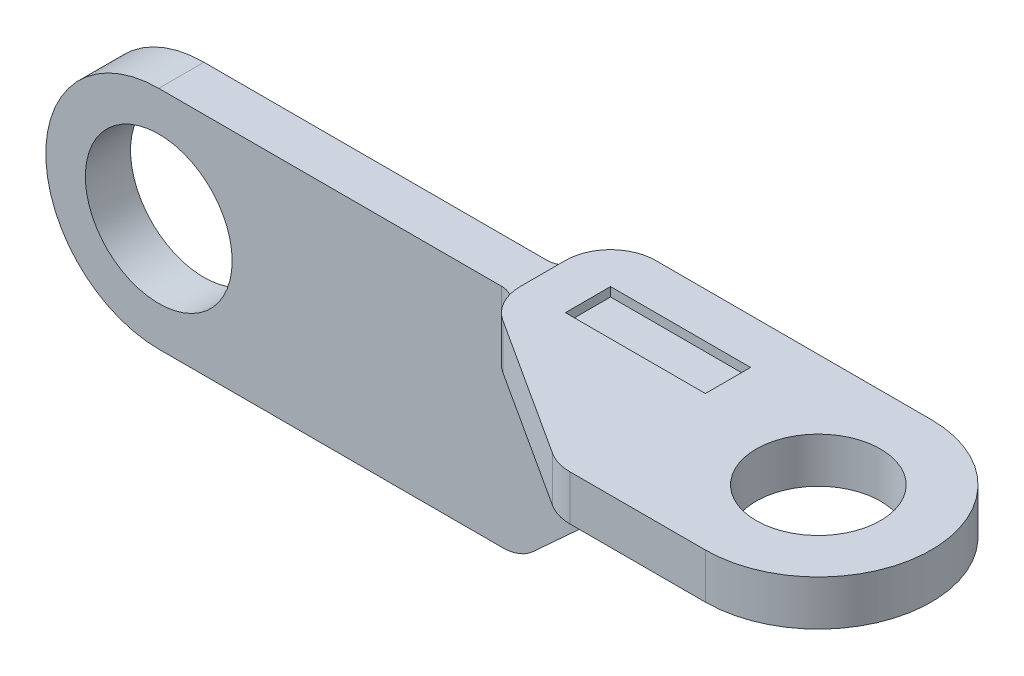
ISO-10303-21;
HEADER;
FILE_DESCRIPTION(('STEP AP214'),'2;1');
FILE_NAME('part.step','',(''),(''),'','','');
FILE_SCHEMA(('AUTOMOTIVE_DESIGN { 1 0 10303 214 1 1 1 1 }'));
ENDSEC;
DATA;
#1=APPLICATION_CONTEXT('core data for automotive mechanical design processes');
#2=APPLICATION_PROTOCOL_DEFINITION('international standard','automotive_design',2000,#1);
#3=PRODUCT_CONTEXT('',#1,'mechanical');
#4=PRODUCT('Part','Part','',(#3));
#5=PRODUCT_RELATED_PRODUCT_CATEGORY('part','',(#4));
#6=PRODUCT_DEFINITION_FORMATION('','',#4);
#7=PRODUCT_DEFINITION_CONTEXT('part definition',#1,'design');
#8=PRODUCT_DEFINITION('design','',#6,#7);
#9=PRODUCT_DEFINITION_SHAPE('','',#8);
#10=(LENGTH_UNIT() NAMED_UNIT(*) SI_UNIT(.MILLI.,.METRE.));
#11=(NAMED_UNIT(*) PLANE_ANGLE_UNIT() SI_UNIT($,.RADIAN.));
#12=(NAMED_UNIT(*) SI_UNIT($,.STERADIAN.) SOLID_ANGLE_UNIT());
#13=UNCERTAINTY_MEASURE_WITH_UNIT(LENGTH_MEASURE(1.E-05),#10,'distance_accuracy_value','');
#14=(GEOMETRIC_REPRESENTATION_CONTEXT(3) GLOBAL_UNCERTAINTY_ASSIGNED_CONTEXT((#13)) GLOBAL_UNIT_ASSIGNED_CONTEXT((#10,
#11,#12)) REPRESENTATION_CONTEXT('',''));
#15=CARTESIAN_POINT('',(0.,0.,0.));
#16=DIRECTION('',(0.,0.,1.));
#17=DIRECTION('',(1.,0.,0.));
#18=AXIS2_PLACEMENT_3D('',#15,#16,#17);
#19=CARTESIAN_POINT('',(-30.2,-3.4,-3.));
#20=DIRECTION('',(0.,0.,1.));
#21=DIRECTION('',(1.,0.,0.));
#22=AXIS2_PLACEMENT_3D('',#19,#20,#21);
#23=PLANE('',#22);
#24=CARTESIAN_POINT('',(-30.2,-3.4,-3.));
#25=DIRECTION('',(0.,0.,1.));
#26=DIRECTION('',(1.,0.,0.));
#27=AXIS2_PLACEMENT_3D('',#24,#25,#26);
#28=CIRCLE('',#27,3.25);
#29=CARTESIAN_POINT('',(-26.95,-3.4,-3.));
#30=VERTEX_POINT('',#29);
#31=EDGE_CURVE('E347',#30,#30,#28,.T.);
#32=ORIENTED_EDGE('',*,*,#31,.T.);
#33=EDGE_LOOP('',(#32));
#34=FACE_BOUND('',#33,.T.);
#35=DIRECTION('',(-1.,0.,0.));
#36=VECTOR('',#35,1.);
#37=CARTESIAN_POINT('',(-15.2,1.6,-3.));
#38=LINE('',#37,#36);
#39=CARTESIAN_POINT('',(-15.0284271247462,1.6,-3.));
#40=VERTEX_POINT('',#39);
#41=CARTESIAN_POINT('',(-30.2,1.6,-3.));
#42=VERTEX_POINT('',#41);
#43=EDGE_CURVE('E355',#40,#42,#38,.T.);
#44=ORIENTED_EDGE('',*,*,#43,.F.);
#45=DIRECTION('',(0.,-1.,0.));
#46=VECTOR('',#45,1.);
#47=CARTESIAN_POINT('',(-15.0284271247462,-3.4,-3.));
#48=LINE('',#47,#46);
#49=CARTESIAN_POINT('',(-15.0284271247462,-1.,-3.));
#50=VERTEX_POINT('',#49);
#51=EDGE_CURVE('E375',#40,#50,#48,.T.);
#52=ORIENTED_EDGE('',*,*,#51,.T.);
#53=DIRECTION('',(-1.,0.,0.));
#54=VECTOR('',#53,1.);
#55=CARTESIAN_POINT('',(-6.,-1.,-3.));
#56=LINE('',#55,#54);
#57=CARTESIAN_POINT('',(-6.26794919243112,-1.,-3.));
#58=VERTEX_POINT('',#57);
#59=EDGE_CURVE('E371',#50,#58,#56,.F.);
#60=ORIENTED_EDGE('',*,*,#59,.T.);
#61=CARTESIAN_POINT('',(-8.,0.,-3.));
#62=DIRECTION('',(0.,0.,1.));
#63=DIRECTION('',(-1.,0.,0.));
#64=AXIS2_PLACEMENT_3D('',#61,#62,#63);
#65=CIRCLE('',#64,2.);
#66=CARTESIAN_POINT('',(-6.64817639570531,-1.47396504126513,-3.));
#67=VERTEX_POINT('',#66);
#68=EDGE_CURVE('E319',#67,#58,#65,.T.);
#69=ORIENTED_EDGE('',*,*,#68,.F.);
#70=DIRECTION('',(0.736982520632564,0.675911802147345,0.));
#71=VECTOR('',#70,1.);
#72=CARTESIAN_POINT('',(-6.64817639570531,-1.47396504126513,-3.));
#73=LINE('',#72,#71);
#74=CARTESIAN_POINT('',(-13.6264361583898,-7.87396504126512,-3.));
#75=VERTEX_POINT('',#74);
#76=EDGE_CURVE('E326',#75,#67,#73,.T.);
#77=ORIENTED_EDGE('',*,*,#76,.F.);
#78=CARTESIAN_POINT('',(-14.9782597626845,-6.4,-3.));
#79=DIRECTION('',(0.,0.,1.));
#80=DIRECTION('',(-1.,0.,0.));
#81=AXIS2_PLACEMENT_3D('',#78,#79,#80);
#82=CIRCLE('',#81,2.);
#83=CARTESIAN_POINT('',(-14.9782597626845,-8.4,-3.));
#84=VERTEX_POINT('',#83);
#85=EDGE_CURVE('E322',#84,#75,#82,.T.);
#86=ORIENTED_EDGE('',*,*,#85,.F.);
#87=DIRECTION('',(1.,0.,0.));
#88=VECTOR('',#87,1.);
#89=CARTESIAN_POINT('',(-30.2,-8.4,-3.));
#90=LINE('',#89,#88);
#91=CARTESIAN_POINT('',(-30.2,-8.4,-3.));
#92=VERTEX_POINT('',#91);
#93=EDGE_CURVE('E353',#92,#84,#90,.T.);
#94=ORIENTED_EDGE('',*,*,#93,.F.);
#95=CARTESIAN_POINT('',(-30.2,-3.4,-3.));
#96=DIRECTION('',(0.,0.,1.));
#97=DIRECTION('',(1.,0.,0.));
#98=AXIS2_PLACEMENT_3D('',#95,#96,#97);
#99=CIRCLE('',#98,5.);
#100=EDGE_CURVE('E359',#42,#92,#99,.T.);
#101=ORIENTED_EDGE('',*,*,#100,.F.);
#102=EDGE_LOOP('',(#44,#52,#60,#69,#77,#86,#94,#101));
#103=FACE_BOUND('',#102,.T.);
#104=ADVANCED_FACE('F39',(#34,#103),#23,.F.);
#105=CARTESIAN_POINT('',(-30.2,-3.4,-1.));
#106=DIRECTION('',(0.,0.,1.));
#107=DIRECTION('',(1.,0.,0.));
#108=AXIS2_PLACEMENT_3D('',#105,#106,#107);
#109=PLANE('',#108);
#110=CARTESIAN_POINT('',(-30.2,-3.4,-1.));
#111=DIRECTION('',(0.,0.,1.));
#112=DIRECTION('',(1.,0.,0.));
#113=AXIS2_PLACEMENT_3D('',#110,#111,#112);
#114=CIRCLE('',#113,3.25);
#115=CARTESIAN_POINT('',(-26.95,-3.4,-1.));
#116=VERTEX_POINT('',#115);
#117=EDGE_CURVE('E340',#116,#116,#114,.T.);
#118=ORIENTED_EDGE('',*,*,#117,.F.);
#119=EDGE_LOOP('',(#118));
#120=FACE_BOUND('',#119,.T.);
#121=DIRECTION('',(-1.,0.,0.));
#122=VECTOR('',#121,1.);
#123=CARTESIAN_POINT('',(-30.2,-1.,-1.));
#124=LINE('',#123,#122);
#125=CARTESIAN_POINT('',(-6.26794919243112,-1.,-1.));
#126=VERTEX_POINT('',#125);
#127=CARTESIAN_POINT('',(-15.0284271247462,-1.,-1.));
#128=VERTEX_POINT('',#127);
#129=EDGE_CURVE('E386',#126,#128,#124,.T.);
#130=ORIENTED_EDGE('',*,*,#129,.T.);
#131=DIRECTION('',(0.,1.,0.));
#132=VECTOR('',#131,1.);
#133=CARTESIAN_POINT('',(-15.0284271247462,1.6,-1.));
#134=LINE('',#133,#132);
#135=CARTESIAN_POINT('',(-15.0284271247462,1.6,-1.));
#136=VERTEX_POINT('',#135);
#137=EDGE_CURVE('E388',#128,#136,#134,.T.);
#138=ORIENTED_EDGE('',*,*,#137,.T.);
#139=DIRECTION('',(-1.,0.,0.));
#140=VECTOR('',#139,1.);
#141=CARTESIAN_POINT('',(-15.2,1.6,-1.));
#142=LINE('',#141,#140);
#143=CARTESIAN_POINT('',(-30.2,1.6,-1.));
#144=VERTEX_POINT('',#143);
#145=EDGE_CURVE('E364',#136,#144,#142,.T.);
#146=ORIENTED_EDGE('',*,*,#145,.T.);
#147=CARTESIAN_POINT('',(-30.2,-3.4,-1.));
#148=DIRECTION('',(0.,0.,1.));
#149=DIRECTION('',(1.,0.,0.));
#150=AXIS2_PLACEMENT_3D('',#147,#148,#149);
#151=CIRCLE('',#150,5.);
#152=CARTESIAN_POINT('',(-30.2,-8.4,-1.));
#153=VERTEX_POINT('',#152);
#154=EDGE_CURVE('E356',#144,#153,#151,.T.);
#155=ORIENTED_EDGE('',*,*,#154,.T.);
#156=DIRECTION('',(1.,0.,0.));
#157=VECTOR('',#156,1.);
#158=CARTESIAN_POINT('',(-30.2,-8.4,-1.));
#159=LINE('',#158,#157);
#160=CARTESIAN_POINT('',(-14.9782597626845,-8.4,-1.));
#161=VERTEX_POINT('',#160);
#162=EDGE_CURVE('E350',#153,#161,#159,.T.);
#163=ORIENTED_EDGE('',*,*,#162,.T.);
#164=CARTESIAN_POINT('',(-14.9782597626845,-6.4,-1.));
#165=DIRECTION('',(0.,0.,1.));
#166=DIRECTION('',(-1.,0.,0.));
#167=AXIS2_PLACEMENT_3D('',#164,#165,#166);
#168=CIRCLE('',#167,2.);
#169=CARTESIAN_POINT('',(-13.6264361583898,-7.87396504126512,-1.));
#170=VERTEX_POINT('',#169);
#171=EDGE_CURVE('E332',#161,#170,#168,.T.);
#172=ORIENTED_EDGE('',*,*,#171,.T.);
#173=DIRECTION('',(0.736982520632564,0.675911802147345,0.));
#174=VECTOR('',#173,1.);
#175=CARTESIAN_POINT('',(-6.64817639570531,-1.47396504126513,-1.));
#176=LINE('',#175,#174);
#177=CARTESIAN_POINT('',(-6.64817639570531,-1.47396504126513,-1.));
#178=VERTEX_POINT('',#177);
#179=EDGE_CURVE('E323',#170,#178,#176,.T.);
#180=ORIENTED_EDGE('',*,*,#179,.T.);
#181=CARTESIAN_POINT('',(-8.,0.,-1.));
#182=DIRECTION('',(0.,0.,1.));
#183=DIRECTION('',(-1.,0.,0.));
#184=AXIS2_PLACEMENT_3D('',#181,#182,#183);
#185=CIRCLE('',#184,2.);
#186=EDGE_CURVE('E318',#178,#126,#185,.T.);
#187=ORIENTED_EDGE('',*,*,#186,.T.);
#188=EDGE_LOOP('',(#130,#138,#146,#155,#163,#172,#180,#187));
#189=FACE_BOUND('',#188,.T.);
#190=ADVANCED_FACE('F459',(#120,#189),#109,.T.);
#191=CARTESIAN_POINT('',(-30.2,-8.4,-3.));
#192=DIRECTION('',(0.,-1.,0.));
#193=DIRECTION('',(0.,0.,-1.));
#194=AXIS2_PLACEMENT_3D('',#191,#192,#193);
#195=PLANE('',#194);
#196=ORIENTED_EDGE('',*,*,#162,.F.);
#197=DIRECTION('',(0.,0.,1.));
#198=VECTOR('',#197,1.);
#199=CARTESIAN_POINT('',(-30.2,-8.4,-3.));
#200=LINE('',#199,#198);
#201=EDGE_CURVE('E369',#92,#153,#200,.T.);
#202=ORIENTED_EDGE('',*,*,#201,.F.);
#203=ORIENTED_EDGE('',*,*,#93,.T.);
#204=DIRECTION('',(0.,0.,1.));
#205=VECTOR('',#204,1.);
#206=CARTESIAN_POINT('',(-14.9782597626845,-8.4,-3.));
#207=LINE('',#206,#205);
#208=EDGE_CURVE('E343',#84,#161,#207,.T.);
#209=ORIENTED_EDGE('',*,*,#208,.T.);
#210=EDGE_LOOP('',(#196,#202,#203,#209));
#211=FACE_BOUND('',#210,.T.);
#212=ADVANCED_FACE('F465',(#211),#195,.T.);
#213=CARTESIAN_POINT('',(-30.2,-3.4,-3.));
#214=DIRECTION('',(0.,0.,1.));
#215=DIRECTION('',(1.,0.,0.));
#216=AXIS2_PLACEMENT_3D('',#213,#214,#215);
#217=CYLINDRICAL_SURFACE('',#216,5.);
#218=ORIENTED_EDGE('',*,*,#154,.F.);
#219=DIRECTION('',(0.,0.,1.));
#220=VECTOR('',#219,1.);
#221=CARTESIAN_POINT('',(-30.2,1.6,-3.));
#222=LINE('',#221,#220);
#223=EDGE_CURVE('E362',#42,#144,#222,.T.);
#224=ORIENTED_EDGE('',*,*,#223,.F.);
#225=ORIENTED_EDGE('',*,*,#100,.T.);
#226=ORIENTED_EDGE('',*,*,#201,.T.);
#227=EDGE_LOOP('',(#218,#224,#225,#226));
#228=FACE_BOUND('',#227,.T.);
#229=ADVANCED_FACE('F472',(#228),#217,.T.);
#230=CARTESIAN_POINT('',(-15.2,1.6,-3.));
#231=DIRECTION('',(0.,1.,0.));
#232=DIRECTION('',(-1.,0.,0.));
#233=AXIS2_PLACEMENT_3D('',#230,#231,#232);
#234=PLANE('',#233);
#235=DIRECTION('',(0.,0.,1.));
#236=VECTOR('',#235,1.);
#237=CARTESIAN_POINT('',(-14.2,1.6,-3.));
#238=LINE('',#237,#236);
#239=CARTESIAN_POINT('',(-14.2,1.6,-3.));
#240=VERTEX_POINT('',#239);
#241=CARTESIAN_POINT('',(-14.2,1.6,-1.));
#242=VERTEX_POINT('',#241);
#243=EDGE_CURVE('E315',#240,#242,#238,.T.);
#244=ORIENTED_EDGE('',*,*,#243,.F.);
#245=CARTESIAN_POINT('',(-12.2,1.6,-3.));
#246=DIRECTION('',(0.,1.,0.));
#247=DIRECTION('',(-1.,0.,0.));
#248=AXIS2_PLACEMENT_3D('',#245,#246,#247);
#249=CIRCLE('',#248,2.);
#250=CARTESIAN_POINT('',(-14.0856180831641,1.6,-3.66666666666667));
#251=VERTEX_POINT('',#250);
#252=EDGE_CURVE('E378',#251,#240,#249,.T.);
#253=ORIENTED_EDGE('',*,*,#252,.F.);
#254=CARTESIAN_POINT('',(-15.0284271247462,1.6,-4.));
#255=DIRECTION('',(0.,1.,0.));
#256=DIRECTION('',(-1.,0.,0.));
#257=AXIS2_PLACEMENT_3D('',#254,#255,#256);
#258=CIRCLE('',#257,1.);
#259=EDGE_CURVE('E397',#251,#40,#258,.F.);
#260=ORIENTED_EDGE('',*,*,#259,.T.);
#261=ORIENTED_EDGE('',*,*,#43,.T.);
#262=ORIENTED_EDGE('',*,*,#223,.T.);
#263=ORIENTED_EDGE('',*,*,#145,.F.);
#264=CARTESIAN_POINT('',(-15.0284271247462,1.6,0.));
#265=DIRECTION('',(0.,1.,0.));
#266=DIRECTION('',(-1.,0.,0.));
#267=AXIS2_PLACEMENT_3D('',#264,#265,#266);
#268=CIRCLE('',#267,1.);
#269=CARTESIAN_POINT('',(-14.0856180831641,1.6,-0.333333333333333));
#270=VERTEX_POINT('',#269);
#271=EDGE_CURVE('E399',#136,#270,#268,.F.);
#272=ORIENTED_EDGE('',*,*,#271,.T.);
#273=CARTESIAN_POINT('',(-12.2,1.6,-0.999999999999999));
#274=DIRECTION('',(0.,1.,0.));
#275=DIRECTION('',(-1.,0.,0.));
#276=AXIS2_PLACEMENT_3D('',#273,#274,#275);
#277=CIRCLE('',#276,2.);
#278=EDGE_CURVE('E56',#242,#270,#277,.T.);
#279=ORIENTED_EDGE('',*,*,#278,.F.);
#280=EDGE_LOOP('',(#244,#253,#260,#261,#262,#263,#272,#279));
#281=FACE_BOUND('',#280,.T.);
#282=ADVANCED_FACE('F475',(#281),#234,.T.);
#283=CARTESIAN_POINT('',(-30.2,-3.4,-3.));
#284=DIRECTION('',(0.,0.,1.));
#285=DIRECTION('',(1.,0.,0.));
#286=AXIS2_PLACEMENT_3D('',#283,#284,#285);
#287=CYLINDRICAL_SURFACE('',#286,3.25);
#288=ORIENTED_EDGE('',*,*,#31,.F.);
#289=EDGE_LOOP('',(#288));
#290=FACE_BOUND('',#289,.T.);
#291=ORIENTED_EDGE('',*,*,#117,.T.);
#292=EDGE_LOOP('',(#291));
#293=FACE_BOUND('',#292,.T.);
#294=ADVANCED_FACE('F470',(#290,#293),#287,.F.);
#295=CARTESIAN_POINT('',(-8.,0.,-3.));
#296=DIRECTION('',(0.,0.,1.));
#297=DIRECTION('',(1.,0.,0.));
#298=AXIS2_PLACEMENT_3D('',#295,#296,#297);
#299=CYLINDRICAL_SURFACE('',#298,2.);
#300=CARTESIAN_POINT('',(-6.26794919243112,-1.,-3.));
#301=CARTESIAN_POINT('',(-6.2523171156908,-0.972937523092784,-2.99999586146288));
#302=CARTESIAN_POINT('',(-6.23732486144332,-0.945491767708699,-3.00109902011735));
#303=CARTESIAN_POINT('',(-6.20883480069671,-0.890323863291279,-3.00565147658146));
#304=CARTESIAN_POINT('',(-6.19532538988156,-0.862606037395238,-3.00908078168916));
#305=CARTESIAN_POINT('',(-6.16974521956329,-0.80691135558499,-3.01841288215393));
#306=CARTESIAN_POINT('',(-6.15767470663455,-0.778934456157756,-3.02431610066874));
#307=CARTESIAN_POINT('',(-6.13492715431275,-0.722797629649888,-3.03874579720785));
#308=CARTESIAN_POINT('',(-6.12426292909353,-0.694638186114848,-3.04729430029037));
#309=CARTESIAN_POINT('',(-6.11438191683587,-0.666666666666666,-3.05719095841794));
#310=B_SPLINE_CURVE_WITH_KNOTS('',3,(#300,#301,#302,#303,#304,#305,#306,#307,#308,#309),
.UNSPECIFIED.,.F.,.F.,(4,2,2,2,4),(0.,0.0937475944765721,0.186699491303913,0.279667293853114,
0.373430993196095),.UNSPECIFIED.);
#311=CARTESIAN_POINT('',(-6.11438191683587,-0.666666666666667,-3.05719095841794));
#312=VERTEX_POINT('',#311);
#313=EDGE_CURVE('E409',#58,#312,#310,.T.);
#314=ORIENTED_EDGE('',*,*,#313,.T.);
#315=DIRECTION('',(0.,0.,1.));
#316=VECTOR('',#315,1.);
#317=CARTESIAN_POINT('',(-6.11438191683587,-0.666666666666667,-3.));
#318=LINE('',#317,#316);
#319=CARTESIAN_POINT('',(-6.11438191683587,-0.666666666666667,-0.942809041582063));
#320=VERTEX_POINT('',#319);
#321=EDGE_CURVE('E63',#312,#320,#318,.T.);
#322=ORIENTED_EDGE('',*,*,#321,.T.);
#323=CARTESIAN_POINT('',(-6.11438191683587,-0.666666666666667,-0.942809041582063));
#324=CARTESIAN_POINT('',(-6.12426292909353,-0.694638186114848,-0.952705699709627));
#325=CARTESIAN_POINT('',(-6.13492715431275,-0.722797629649888,-0.961254202792148));
#326=CARTESIAN_POINT('',(-6.15767470663455,-0.778934456157756,-0.97568389933126));
#327=CARTESIAN_POINT('',(-6.16974521956329,-0.80691135558499,-0.981587117846074));
#328=CARTESIAN_POINT('',(-6.19532538988156,-0.862606037395238,-0.990919218310843));
#329=CARTESIAN_POINT('',(-6.20883480069671,-0.890323863291279,-0.994348523418535));
#330=CARTESIAN_POINT('',(-6.23732486144332,-0.945491767708698,-0.998900979882648));
#331=CARTESIAN_POINT('',(-6.2523171156908,-0.972937523092784,-1.00000413853712));
#332=CARTESIAN_POINT('',(-6.26794919243112,-1.,-1.));
#333=B_SPLINE_CURVE_WITH_KNOTS('',3,(#323,#324,#325,#326,#327,#328,#329,#330,#331,#332),
.UNSPECIFIED.,.F.,.F.,(4,2,2,2,4),(0.,0.0937636993429808,0.186731501892181,0.279683398719522,
0.373430993196094),.UNSPECIFIED.);
#334=EDGE_CURVE('E11',#320,#126,#333,.T.);
#335=ORIENTED_EDGE('',*,*,#334,.T.);
#336=ORIENTED_EDGE('',*,*,#186,.F.);
#337=DIRECTION('',(0.,0.,1.));
#338=VECTOR('',#337,1.);
#339=CARTESIAN_POINT('',(-6.64817639570531,-1.47396504126513,-3.));
#340=LINE('',#339,#338);
#341=EDGE_CURVE('E338',#67,#178,#340,.T.);
#342=ORIENTED_EDGE('',*,*,#341,.F.);
#343=ORIENTED_EDGE('',*,*,#68,.T.);
#344=EDGE_LOOP('',(#314,#322,#335,#336,#342,#343));
#345=FACE_BOUND('',#344,.T.);
#346=ADVANCED_FACE('F532',(#345),#299,.T.);
#347=CARTESIAN_POINT('',(-6.64817639570531,-1.47396504126513,-3.));
#348=DIRECTION('',(0.675911802147345,-0.736982520632564,0.));
#349=DIRECTION('',(0.736982520632564,0.675911802147345,0.));
#350=AXIS2_PLACEMENT_3D('',#347,#348,#349);
#351=PLANE('',#350);
#352=ORIENTED_EDGE('',*,*,#179,.F.);
#353=DIRECTION('',(0.,0.,1.));
#354=VECTOR('',#353,1.);
#355=CARTESIAN_POINT('',(-13.6264361583898,-7.87396504126512,-3.));
#356=LINE('',#355,#354);
#357=EDGE_CURVE('E341',#75,#170,#356,.T.);
#358=ORIENTED_EDGE('',*,*,#357,.F.);
#359=ORIENTED_EDGE('',*,*,#76,.T.);
#360=ORIENTED_EDGE('',*,*,#341,.T.);
#361=EDGE_LOOP('',(#352,#358,#359,#360));
#362=FACE_BOUND('',#361,.T.);
#363=ADVANCED_FACE('F536',(#362),#351,.T.);
#364=CARTESIAN_POINT('',(-14.9782597626845,-6.4,-3.));
#365=DIRECTION('',(0.,0.,1.));
#366=DIRECTION('',(1.,0.,0.));
#367=AXIS2_PLACEMENT_3D('',#364,#365,#366);
#368=CYLINDRICAL_SURFACE('',#367,2.);
#369=ORIENTED_EDGE('',*,*,#171,.F.);
#370=ORIENTED_EDGE('',*,*,#208,.F.);
#371=ORIENTED_EDGE('',*,*,#85,.T.);
#372=ORIENTED_EDGE('',*,*,#357,.T.);
#373=EDGE_LOOP('',(#369,#370,#371,#372));
#374=FACE_BOUND('',#373,.T.);
#375=ADVANCED_FACE('F541',(#374),#368,.T.);
#376=CARTESIAN_POINT('',(0.,0.,0.));
#377=DIRECTION('',(0.,1.,0.));
#378=DIRECTION('',(0.,0.,1.));
#379=AXIS2_PLACEMENT_3D('',#376,#377,#378);
#380=PLANE('',#379);
#381=CARTESIAN_POINT('',(0.,0.,0.));
#382=DIRECTION('',(0.,1.,0.));
#383=DIRECTION('',(0.,0.,1.));
#384=AXIS2_PLACEMENT_3D('',#381,#382,#383);
#385=CIRCLE('',#384,2.75);
#386=CARTESIAN_POINT('',(0.,0.,2.75));
#387=VERTEX_POINT('',#386);
#388=EDGE_CURVE('E275',#387,#387,#385,.T.);
#389=ORIENTED_EDGE('',*,*,#388,.T.);
#390=EDGE_LOOP('',(#389));
#391=FACE_BOUND('',#390,.T.);
#392=DIRECTION('',(0.,0.,1.));
#393=VECTOR('',#392,1.);
#394=CARTESIAN_POINT('',(-5.17157287525381,0.,0.));
#395=LINE('',#394,#393);
#396=CARTESIAN_POINT('',(-5.17157287525381,0.,0.));
#397=VERTEX_POINT('',#396);
#398=CARTESIAN_POINT('',(-5.17157287525381,0.,-4.));
#399=VERTEX_POINT('',#398);
#400=EDGE_CURVE('E392',#397,#399,#395,.F.);
#401=ORIENTED_EDGE('',*,*,#400,.T.);
#402=DIRECTION('',(-1.,0.,0.));
#403=VECTOR('',#402,1.);
#404=CARTESIAN_POINT('',(-14.2,0.,-4.));
#405=LINE('',#404,#403);
#406=CARTESIAN_POINT('',(-13.9320508075689,0.,-4.));
#407=VERTEX_POINT('',#406);
#408=EDGE_CURVE('E394',#399,#407,#405,.T.);
#409=ORIENTED_EDGE('',*,*,#408,.T.);
#410=CARTESIAN_POINT('',(-12.2,0.,-3.));
#411=DIRECTION('',(0.,-1.,0.));
#412=DIRECTION('',(0.,0.,1.));
#413=AXIS2_PLACEMENT_3D('',#410,#411,#412);
#414=CIRCLE('',#413,2.);
#415=CARTESIAN_POINT('',(-12.2,0.,-5.));
#416=VERTEX_POINT('',#415);
#417=EDGE_CURVE('E250',#407,#416,#414,.T.);
#418=ORIENTED_EDGE('',*,*,#417,.T.);
#419=DIRECTION('',(-1.,0.,0.));
#420=VECTOR('',#419,1.);
#421=CARTESIAN_POINT('',(0.,0.,-5.));
#422=LINE('',#421,#420);
#423=CARTESIAN_POINT('',(0.,0.,-5.));
#424=VERTEX_POINT('',#423);
#425=EDGE_CURVE('E304',#424,#416,#422,.T.);
#426=ORIENTED_EDGE('',*,*,#425,.F.);
#427=CARTESIAN_POINT('',(0.,0.,0.));
#428=DIRECTION('',(0.,1.,0.));
#429=DIRECTION('',(0.,0.,1.));
#430=AXIS2_PLACEMENT_3D('',#427,#428,#429);
#431=CIRCLE('',#430,5.);
#432=CARTESIAN_POINT('',(0.,0.,5.));
#433=VERTEX_POINT('',#432);
#434=EDGE_CURVE('E290',#433,#424,#431,.T.);
#435=ORIENTED_EDGE('',*,*,#434,.F.);
#436=DIRECTION('',(1.,0.,0.));
#437=VECTOR('',#436,1.);
#438=CARTESIAN_POINT('',(-5.,0.,5.));
#439=LINE('',#438,#437);
#440=CARTESIAN_POINT('',(-6.,0.,5.));
#441=VERTEX_POINT('',#440);
#442=EDGE_CURVE('E297',#441,#433,#439,.T.);
#443=ORIENTED_EDGE('',*,*,#442,.F.);
#444=CARTESIAN_POINT('',(-6.,0.,3.));
#445=DIRECTION('',(0.,-1.,0.));
#446=DIRECTION('',(0.,0.,1.));
#447=AXIS2_PLACEMENT_3D('',#444,#445,#446);
#448=CIRCLE('',#447,2.);
#449=CARTESIAN_POINT('',(-7.08425373964418,0.,4.68059329644849));
#450=VERTEX_POINT('',#449);
#451=EDGE_CURVE('E241',#441,#450,#448,.T.);
#452=ORIENTED_EDGE('',*,*,#451,.T.);
#453=DIRECTION('',(-0.840296648224244,0.,-0.542126869822093));
#454=VECTOR('',#453,1.);
#455=CARTESIAN_POINT('',(-13.2842537396442,0.,0.68059329644849));
#456=LINE('',#455,#454);
#457=CARTESIAN_POINT('',(-13.2842537396442,0.,0.680593296448489));
#458=VERTEX_POINT('',#457);
#459=EDGE_CURVE('E265',#450,#458,#456,.T.);
#460=ORIENTED_EDGE('',*,*,#459,.T.);
#461=CARTESIAN_POINT('',(-12.2,0.,-0.999999999999999));
#462=DIRECTION('',(0.,-1.,0.));
#463=DIRECTION('',(0.,0.,1.));
#464=AXIS2_PLACEMENT_3D('',#461,#462,#463);
#465=CIRCLE('',#464,2.);
#466=CARTESIAN_POINT('',(-13.9320508075689,0.,0.));
#467=VERTEX_POINT('',#466);
#468=EDGE_CURVE('E268',#458,#467,#465,.T.);
#469=ORIENTED_EDGE('',*,*,#468,.T.);
#470=DIRECTION('',(-1.,0.,0.));
#471=VECTOR('',#470,1.);
#472=CARTESIAN_POINT('',(0.,0.,0.));
#473=LINE('',#472,#471);
#474=EDGE_CURVE('E390',#467,#397,#473,.F.);
#475=ORIENTED_EDGE('',*,*,#474,.T.);
#476=EDGE_LOOP('',(#401,#409,#418,#426,#435,#443,#452,#460,#469,#475));
#477=FACE_BOUND('',#476,.T.);
#478=ADVANCED_FACE('F543',(#391,#477),#380,.F.);
#479=CARTESIAN_POINT('',(0.,2.,0.));
#480=DIRECTION('',(0.,1.,0.));
#481=DIRECTION('',(0.,0.,1.));
#482=AXIS2_PLACEMENT_3D('',#479,#480,#481);
#483=PLANE('',#482);
#484=CARTESIAN_POINT('',(0.,2.,0.));
#485=DIRECTION('',(0.,1.,0.));
#486=DIRECTION('',(0.,0.,1.));
#487=AXIS2_PLACEMENT_3D('',#484,#485,#486);
#488=CIRCLE('',#487,5.);
#489=CARTESIAN_POINT('',(0.,2.,5.));
#490=VERTEX_POINT('',#489);
#491=CARTESIAN_POINT('',(0.,2.,-5.));
#492=VERTEX_POINT('',#491);
#493=EDGE_CURVE('E293',#490,#492,#488,.T.);
#494=ORIENTED_EDGE('',*,*,#493,.T.);
#495=DIRECTION('',(-1.,0.,0.));
#496=VECTOR('',#495,1.);
#497=CARTESIAN_POINT('',(0.,2.,-5.));
#498=LINE('',#497,#496);
#499=CARTESIAN_POINT('',(-12.2,2.,-5.));
#500=VERTEX_POINT('',#499);
#501=EDGE_CURVE('E296',#492,#500,#498,.T.);
#502=ORIENTED_EDGE('',*,*,#501,.T.);
#503=CARTESIAN_POINT('',(-12.2,2.,-3.));
#504=DIRECTION('',(0.,-1.,0.));
#505=DIRECTION('',(0.,0.,1.));
#506=AXIS2_PLACEMENT_3D('',#503,#504,#505);
#507=CIRCLE('',#506,2.);
#508=CARTESIAN_POINT('',(-14.2,2.,-3.));
#509=VERTEX_POINT('',#508);
#510=EDGE_CURVE('E259',#509,#500,#507,.T.);
#511=ORIENTED_EDGE('',*,*,#510,.F.);
#512=DIRECTION('',(0.,0.,-1.));
#513=VECTOR('',#512,1.);
#514=CARTESIAN_POINT('',(-14.2,2.,-3.));
#515=LINE('',#514,#513);
#516=CARTESIAN_POINT('',(-14.2,2.,-1.));
#517=VERTEX_POINT('',#516);
#518=EDGE_CURVE('E256',#517,#509,#515,.T.);
#519=ORIENTED_EDGE('',*,*,#518,.F.);
#520=CARTESIAN_POINT('',(-12.2,2.,-0.999999999999999));
#521=DIRECTION('',(0.,-1.,0.));
#522=DIRECTION('',(0.,0.,1.));
#523=AXIS2_PLACEMENT_3D('',#520,#521,#522);
#524=CIRCLE('',#523,2.);
#525=CARTESIAN_POINT('',(-13.2842537396442,2.,0.680593296448489));
#526=VERTEX_POINT('',#525);
#527=EDGE_CURVE('E253',#526,#517,#524,.T.);
#528=ORIENTED_EDGE('',*,*,#527,.F.);
#529=DIRECTION('',(-0.840296648224244,0.,-0.542126869822093));
#530=VECTOR('',#529,1.);
#531=CARTESIAN_POINT('',(-13.2842537396442,2.,0.68059329644849));
#532=LINE('',#531,#530);
#533=CARTESIAN_POINT('',(-7.08425373964418,2.,4.68059329644849));
#534=VERTEX_POINT('',#533);
#535=EDGE_CURVE('E249',#534,#526,#532,.T.);
#536=ORIENTED_EDGE('',*,*,#535,.F.);
#537=CARTESIAN_POINT('',(-6.,2.,3.));
#538=DIRECTION('',(0.,-1.,0.));
#539=DIRECTION('',(0.,0.,1.));
#540=AXIS2_PLACEMENT_3D('',#537,#538,#539);
#541=CIRCLE('',#540,2.);
#542=CARTESIAN_POINT('',(-6.,2.,5.));
#543=VERTEX_POINT('',#542);
#544=EDGE_CURVE('E246',#543,#534,#541,.T.);
#545=ORIENTED_EDGE('',*,*,#544,.F.);
#546=DIRECTION('',(1.,0.,0.));
#547=VECTOR('',#546,1.);
#548=CARTESIAN_POINT('',(-5.,2.,5.));
#549=LINE('',#548,#547);
#550=EDGE_CURVE('E299',#543,#490,#549,.T.);
#551=ORIENTED_EDGE('',*,*,#550,.T.);
#552=EDGE_LOOP('',(#494,#502,#511,#519,#528,#536,#545,#551));
#553=FACE_BOUND('',#552,.T.);
#554=CARTESIAN_POINT('',(0.,2.,0.));
#555=DIRECTION('',(0.,1.,0.));
#556=DIRECTION('',(0.,0.,1.));
#557=AXIS2_PLACEMENT_3D('',#554,#555,#556);
#558=CIRCLE('',#557,2.75);
#559=CARTESIAN_POINT('',(0.,2.,2.75));
#560=VERTEX_POINT('',#559);
#561=EDGE_CURVE('E287',#560,#560,#558,.T.);
#562=ORIENTED_EDGE('',*,*,#561,.F.);
#563=EDGE_LOOP('',(#562));
#564=FACE_BOUND('',#563,.T.);
#565=DIRECTION('',(0.,0.,1.));
#566=VECTOR('',#565,1.);
#567=CARTESIAN_POINT('',(-6.,2.,-3.));
#568=LINE('',#567,#566);
#569=CARTESIAN_POINT('',(-6.,2.,-3.));
#570=VERTEX_POINT('',#569);
#571=CARTESIAN_POINT('',(-6.,2.,-0.999999999999999));
#572=VERTEX_POINT('',#571);
#573=EDGE_CURVE('E214',#570,#572,#568,.T.);
#574=ORIENTED_EDGE('',*,*,#573,.T.);
#575=DIRECTION('',(-1.,0.,0.));
#576=VECTOR('',#575,1.);
#577=CARTESIAN_POINT('',(-6.,2.,-0.999999999999999));
#578=LINE('',#577,#576);
#579=CARTESIAN_POINT('',(-12.2,2.,-1.));
#580=VERTEX_POINT('',#579);
#581=EDGE_CURVE('E224',#572,#580,#578,.T.);
#582=ORIENTED_EDGE('',*,*,#581,.T.);
#583=DIRECTION('',(0.,0.,-1.));
#584=VECTOR('',#583,1.);
#585=CARTESIAN_POINT('',(-12.2,2.,-3.));
#586=LINE('',#585,#584);
#587=CARTESIAN_POINT('',(-12.2,2.,-3.));
#588=VERTEX_POINT('',#587);
#589=EDGE_CURVE('E229',#580,#588,#586,.T.);
#590=ORIENTED_EDGE('',*,*,#589,.T.);
#591=DIRECTION('',(1.,0.,0.));
#592=VECTOR('',#591,1.);
#593=CARTESIAN_POINT('',(-6.,2.,-3.));
#594=LINE('',#593,#592);
#595=EDGE_CURVE('E220',#588,#570,#594,.T.);
#596=ORIENTED_EDGE('',*,*,#595,.T.);
#597=EDGE_LOOP('',(#574,#582,#590,#596));
#598=FACE_BOUND('',#597,.T.);
#599=ADVANCED_FACE('F231',(#553,#564,#598),#483,.T.);
#600=CARTESIAN_POINT('',(0.,2.,0.));
#601=DIRECTION('',(0.,-1.,0.));
#602=DIRECTION('',(0.,0.,-1.));
#603=AXIS2_PLACEMENT_3D('',#600,#601,#602);
#604=CYLINDRICAL_SURFACE('',#603,5.);
#605=ORIENTED_EDGE('',*,*,#434,.T.);
#606=DIRECTION('',(0.,-1.,0.));
#607=VECTOR('',#606,1.);
#608=CARTESIAN_POINT('',(0.,2.,-5.));
#609=LINE('',#608,#607);
#610=EDGE_CURVE('E310',#492,#424,#609,.T.);
#611=ORIENTED_EDGE('',*,*,#610,.F.);
#612=ORIENTED_EDGE('',*,*,#493,.F.);
#613=DIRECTION('',(0.,-1.,0.));
#614=VECTOR('',#613,1.);
#615=CARTESIAN_POINT('',(0.,2.,5.));
#616=LINE('',#615,#614);
#617=EDGE_CURVE('E301',#490,#433,#616,.T.);
#618=ORIENTED_EDGE('',*,*,#617,.T.);
#619=EDGE_LOOP('',(#605,#611,#612,#618));
#620=FACE_BOUND('',#619,.T.);
#621=ADVANCED_FACE('F691',(#620),#604,.T.);
#622=CARTESIAN_POINT('',(0.,2.,-5.));
#623=DIRECTION('',(0.,0.,1.));
#624=DIRECTION('',(1.,0.,0.));
#625=AXIS2_PLACEMENT_3D('',#622,#623,#624);
#626=PLANE('',#625);
#627=ORIENTED_EDGE('',*,*,#425,.T.);
#628=DIRECTION('',(0.,-1.,0.));
#629=VECTOR('',#628,1.);
#630=CARTESIAN_POINT('',(-12.2,2.,-5.));
#631=LINE('',#630,#629);
#632=EDGE_CURVE('E272',#500,#416,#631,.T.);
#633=ORIENTED_EDGE('',*,*,#632,.F.);
#634=ORIENTED_EDGE('',*,*,#501,.F.);
#635=ORIENTED_EDGE('',*,*,#610,.T.);
#636=EDGE_LOOP('',(#627,#633,#634,#635));
#637=FACE_BOUND('',#636,.T.);
#638=ADVANCED_FACE('F514',(#637),#626,.F.);
#639=CARTESIAN_POINT('',(-5.,2.,5.));
#640=DIRECTION('',(0.,0.,-1.));
#641=DIRECTION('',(-1.,0.,0.));
#642=AXIS2_PLACEMENT_3D('',#639,#640,#641);
#643=PLANE('',#642);
#644=ORIENTED_EDGE('',*,*,#442,.T.);
#645=ORIENTED_EDGE('',*,*,#617,.F.);
#646=ORIENTED_EDGE('',*,*,#550,.F.);
#647=DIRECTION('',(0.,-1.,0.));
#648=VECTOR('',#647,1.);
#649=CARTESIAN_POINT('',(-6.,2.,5.));
#650=LINE('',#649,#648);
#651=EDGE_CURVE('E262',#543,#441,#650,.T.);
#652=ORIENTED_EDGE('',*,*,#651,.T.);
#653=EDGE_LOOP('',(#644,#645,#646,#652));
#654=FACE_BOUND('',#653,.T.);
#655=ADVANCED_FACE('F670',(#654),#643,.F.);
#656=CARTESIAN_POINT('',(0.,2.,0.));
#657=DIRECTION('',(0.,-1.,0.));
#658=DIRECTION('',(0.,0.,-1.));
#659=AXIS2_PLACEMENT_3D('',#656,#657,#658);
#660=CYLINDRICAL_SURFACE('',#659,2.75);
#661=ORIENTED_EDGE('',*,*,#561,.T.);
#662=EDGE_LOOP('',(#661));
#663=FACE_BOUND('',#662,.T.);
#664=ORIENTED_EDGE('',*,*,#388,.F.);
#665=EDGE_LOOP('',(#664));
#666=FACE_BOUND('',#665,.T.);
#667=ADVANCED_FACE('F425',(#663,#666),#660,.F.);
#668=CARTESIAN_POINT('',(-12.2,2.,-3.));
#669=DIRECTION('',(0.,-1.,0.));
#670=DIRECTION('',(0.,0.,-1.));
#671=AXIS2_PLACEMENT_3D('',#668,#669,#670);
#672=CYLINDRICAL_SURFACE('',#671,2.);
#673=ORIENTED_EDGE('',*,*,#417,.F.);
#674=CARTESIAN_POINT('',(-13.9320508075689,0.,-4.));
#675=CARTESIAN_POINT('',(-13.9476828843092,4.13853712170752E-06,-3.97293752309278));
#676=CARTESIAN_POINT('',(-13.9626751385567,-0.00109902011735252,-3.9454917677087));
#677=CARTESIAN_POINT('',(-13.9911651993033,-0.00565147658146456,-3.89032386329128));
#678=CARTESIAN_POINT('',(-14.0046746101184,-0.00908078168915633,-3.86260603739524));
#679=CARTESIAN_POINT('',(-14.0302547804367,-0.018412882153926,-3.80691135558499));
#680=CARTESIAN_POINT('',(-14.0423252933654,-0.0243161006687398,-3.77893445615776));
#681=CARTESIAN_POINT('',(-14.0650728456872,-0.0387457972078521,-3.72279762964989));
#682=CARTESIAN_POINT('',(-14.0757370709065,-0.0472943002903733,-3.69463818611485));
#683=CARTESIAN_POINT('',(-14.0856180831641,-0.0571909584179365,-3.66666666666667));
#684=B_SPLINE_CURVE_WITH_KNOTS('',3,(#674,#675,#676,#677,#678,#679,#680,#681,#682,#683),
.UNSPECIFIED.,.F.,.F.,(4,2,2,2,4),(0.,0.093747594476572,0.186699491303913,0.279667293853114,
0.373430993196093),.UNSPECIFIED.);
#685=CARTESIAN_POINT('',(-14.0856180831641,-0.0571909584179367,-3.66666666666667));
#686=VERTEX_POINT('',#685);
#687=EDGE_CURVE('E401',#407,#686,#684,.T.);
#688=ORIENTED_EDGE('',*,*,#687,.T.);
#689=DIRECTION('',(0.,-1.,0.));
#690=VECTOR('',#689,1.);
#691=CARTESIAN_POINT('',(-14.0856180831641,2.,-3.66666666666667));
#692=LINE('',#691,#690);
#693=EDGE_CURVE('E380',#686,#251,#692,.F.);
#694=ORIENTED_EDGE('',*,*,#693,.T.);
#695=ORIENTED_EDGE('',*,*,#252,.T.);
#696=DIRECTION('',(0.,-1.,0.));
#697=VECTOR('',#696,1.);
#698=CARTESIAN_POINT('',(-14.2,2.,-3.));
#699=LINE('',#698,#697);
#700=EDGE_CURVE('E276',#509,#240,#699,.T.);
#701=ORIENTED_EDGE('',*,*,#700,.F.);
#702=ORIENTED_EDGE('',*,*,#510,.T.);
#703=ORIENTED_EDGE('',*,*,#632,.T.);
#704=EDGE_LOOP('',(#673,#688,#694,#695,#701,#702,#703));
#705=FACE_BOUND('',#704,.T.);
#706=ADVANCED_FACE('F419',(#705),#672,.T.);
#707=CARTESIAN_POINT('',(-14.2,2.,-3.));
#708=DIRECTION('',(-1.,0.,0.));
#709=DIRECTION('',(0.,0.,1.));
#710=AXIS2_PLACEMENT_3D('',#707,#708,#709);
#711=PLANE('',#710);
#712=ORIENTED_EDGE('',*,*,#700,.T.);
#713=ORIENTED_EDGE('',*,*,#243,.T.);
#714=DIRECTION('',(0.,-1.,0.));
#715=VECTOR('',#714,1.);
#716=CARTESIAN_POINT('',(-14.2,2.,-1.));
#717=LINE('',#716,#715);
#718=EDGE_CURVE('E279',#517,#242,#717,.T.);
#719=ORIENTED_EDGE('',*,*,#718,.F.);
#720=ORIENTED_EDGE('',*,*,#518,.T.);
#721=EDGE_LOOP('',(#712,#713,#719,#720));
#722=FACE_BOUND('',#721,.T.);
#723=ADVANCED_FACE('F424',(#722),#711,.T.);
#724=CARTESIAN_POINT('',(-12.2,2.,-0.999999999999999));
#725=DIRECTION('',(0.,-1.,0.));
#726=DIRECTION('',(0.,0.,-1.));
#727=AXIS2_PLACEMENT_3D('',#724,#725,#726);
#728=CYLINDRICAL_SURFACE('',#727,2.);
#729=ORIENTED_EDGE('',*,*,#278,.T.);
#730=DIRECTION('',(0.,-1.,0.));
#731=VECTOR('',#730,1.);
#732=CARTESIAN_POINT('',(-14.0856180831641,2.,-0.333333333333333));
#733=LINE('',#732,#731);
#734=CARTESIAN_POINT('',(-14.0856180831641,-0.0571909584179364,-0.333333333333333));
#735=VERTEX_POINT('',#734);
#736=EDGE_CURVE('E384',#270,#735,#733,.T.);
#737=ORIENTED_EDGE('',*,*,#736,.T.);
#738=CARTESIAN_POINT('',(-14.0856180831641,-0.0571909584179364,-0.333333333333333));
#739=CARTESIAN_POINT('',(-14.0757370709065,-0.047294300290373,-0.305361813885152));
#740=CARTESIAN_POINT('',(-14.0650728456872,-0.0387457972078518,-0.277202370350112));
#741=CARTESIAN_POINT('',(-14.0423252933654,-0.0243161006687396,-0.221065543842243));
#742=CARTESIAN_POINT('',(-14.0302547804367,-0.018412882153926,-0.193088644415009));
#743=CARTESIAN_POINT('',(-14.0046746101184,-0.00908078168915649,-0.137393962604761));
#744=CARTESIAN_POINT('',(-13.9911651993033,-0.0056514765814647,-0.10967613670872));
#745=CARTESIAN_POINT('',(-13.9626751385567,-0.00109902011735255,-0.054508232291301));
#746=CARTESIAN_POINT('',(-13.9476828843092,4.13853712176514E-06,-0.0270624769072156));
#747=CARTESIAN_POINT('',(-13.9320508075689,0.,0.));
#748=B_SPLINE_CURVE_WITH_KNOTS('',3,(#738,#739,#740,#741,#742,#743,#744,#745,#746,#747),
.UNSPECIFIED.,.F.,.F.,(4,2,2,2,4),(0.,0.093763699342981,0.186731501892181,0.279683398719522,
0.373430993196094),.UNSPECIFIED.);
#749=EDGE_CURVE('E48',#735,#467,#748,.T.);
#750=ORIENTED_EDGE('',*,*,#749,.T.);
#751=ORIENTED_EDGE('',*,*,#468,.F.);
#752=DIRECTION('',(0.,-1.,0.));
#753=VECTOR('',#752,1.);
#754=CARTESIAN_POINT('',(-13.2842537396442,2.,0.680593296448489));
#755=LINE('',#754,#753);
#756=EDGE_CURVE('E281',#526,#458,#755,.T.);
#757=ORIENTED_EDGE('',*,*,#756,.F.);
#758=ORIENTED_EDGE('',*,*,#527,.T.);
#759=ORIENTED_EDGE('',*,*,#718,.T.);
#760=EDGE_LOOP('',(#729,#737,#750,#751,#757,#758,#759));
#761=FACE_BOUND('',#760,.T.);
#762=ADVANCED_FACE('F430',(#761),#728,.T.);
#763=CARTESIAN_POINT('',(-13.2842537396442,2.,0.68059329644849));
#764=DIRECTION('',(-0.542126869822093,0.,0.840296648224244));
#765=DIRECTION('',(0.840296648224244,0.,0.542126869822093));
#766=AXIS2_PLACEMENT_3D('',#763,#764,#765);
#767=PLANE('',#766);
#768=ORIENTED_EDGE('',*,*,#459,.F.);
#769=DIRECTION('',(0.,-1.,0.));
#770=VECTOR('',#769,1.);
#771=CARTESIAN_POINT('',(-7.08425373964418,2.,4.68059329644849));
#772=LINE('',#771,#770);
#773=EDGE_CURVE('E283',#534,#450,#772,.T.);
#774=ORIENTED_EDGE('',*,*,#773,.F.);
#775=ORIENTED_EDGE('',*,*,#535,.T.);
#776=ORIENTED_EDGE('',*,*,#756,.T.);
#777=EDGE_LOOP('',(#768,#774,#775,#776));
#778=FACE_BOUND('',#777,.T.);
#779=ADVANCED_FACE('F435',(#778),#767,.T.);
#780=CARTESIAN_POINT('',(-6.,2.,3.));
#781=DIRECTION('',(0.,-1.,0.));
#782=DIRECTION('',(0.,0.,-1.));
#783=AXIS2_PLACEMENT_3D('',#780,#781,#782);
#784=CYLINDRICAL_SURFACE('',#783,2.);
#785=ORIENTED_EDGE('',*,*,#451,.F.);
#786=ORIENTED_EDGE('',*,*,#651,.F.);
#787=ORIENTED_EDGE('',*,*,#544,.T.);
#788=ORIENTED_EDGE('',*,*,#773,.T.);
#789=EDGE_LOOP('',(#785,#786,#787,#788));
#790=FACE_BOUND('',#789,.T.);
#791=ADVANCED_FACE('F638',(#790),#784,.T.);
#792=CARTESIAN_POINT('',(-6.,2.,-3.));
#793=DIRECTION('',(1.,0.,0.));
#794=DIRECTION('',(0.,0.,-1.));
#795=AXIS2_PLACEMENT_3D('',#792,#793,#794);
#796=PLANE('',#795);
#797=DIRECTION('',(0.,0.,1.));
#798=VECTOR('',#797,1.);
#799=CARTESIAN_POINT('',(-6.,1.6,-3.));
#800=LINE('',#799,#798);
#801=CARTESIAN_POINT('',(-6.,1.6,-3.));
#802=VERTEX_POINT('',#801);
#803=CARTESIAN_POINT('',(-6.,1.6,-1.));
#804=VERTEX_POINT('',#803);
#805=EDGE_CURVE('E216',#802,#804,#800,.T.);
#806=ORIENTED_EDGE('',*,*,#805,.T.);
#807=DIRECTION('',(0.,-1.,0.));
#808=VECTOR('',#807,1.);
#809=CARTESIAN_POINT('',(-6.,2.,-0.999999999999999));
#810=LINE('',#809,#808);
#811=EDGE_CURVE('E209',#572,#804,#810,.T.);
#812=ORIENTED_EDGE('',*,*,#811,.F.);
#813=ORIENTED_EDGE('',*,*,#573,.F.);
#814=DIRECTION('',(0.,-1.,0.));
#815=VECTOR('',#814,1.);
#816=CARTESIAN_POINT('',(-6.,2.,-3.));
#817=LINE('',#816,#815);
#818=EDGE_CURVE('E239',#570,#802,#817,.T.);
#819=ORIENTED_EDGE('',*,*,#818,.T.);
#820=EDGE_LOOP('',(#806,#812,#813,#819));
#821=FACE_BOUND('',#820,.T.);
#822=ADVANCED_FACE('F211',(#821),#796,.F.);
#823=CARTESIAN_POINT('',(-6.,2.,-3.));
#824=DIRECTION('',(0.,0.,-1.));
#825=DIRECTION('',(-1.,0.,0.));
#826=AXIS2_PLACEMENT_3D('',#823,#824,#825);
#827=PLANE('',#826);
#828=CARTESIAN_POINT('',(-12.2,1.6,-3.));
#829=VERTEX_POINT('',#828);
#830=EDGE_CURVE('E357',#802,#829,#38,.T.);
#831=ORIENTED_EDGE('',*,*,#830,.F.);
#832=ORIENTED_EDGE('',*,*,#818,.F.);
#833=ORIENTED_EDGE('',*,*,#595,.F.);
#834=DIRECTION('',(0.,-1.,0.));
#835=VECTOR('',#834,1.);
#836=CARTESIAN_POINT('',(-12.2,2.,-3.));
#837=LINE('',#836,#835);
#838=EDGE_CURVE('E242',#588,#829,#837,.T.);
#839=ORIENTED_EDGE('',*,*,#838,.T.);
#840=EDGE_LOOP('',(#831,#832,#833,#839));
#841=FACE_BOUND('',#840,.T.);
#842=ADVANCED_FACE('F619',(#841),#827,.F.);
#843=CARTESIAN_POINT('',(-12.2,2.,-3.));
#844=DIRECTION('',(-1.,0.,0.));
#845=DIRECTION('',(0.,0.,1.));
#846=AXIS2_PLACEMENT_3D('',#843,#844,#845);
#847=PLANE('',#846);
#848=DIRECTION('',(0.,0.,1.));
#849=VECTOR('',#848,1.);
#850=CARTESIAN_POINT('',(-12.2,1.6,-3.));
#851=LINE('',#850,#849);
#852=CARTESIAN_POINT('',(-12.2,1.6,-1.));
#853=VERTEX_POINT('',#852);
#854=EDGE_CURVE('E313',#829,#853,#851,.T.);
#855=ORIENTED_EDGE('',*,*,#854,.F.);
#856=ORIENTED_EDGE('',*,*,#838,.F.);
#857=ORIENTED_EDGE('',*,*,#589,.F.);
#858=DIRECTION('',(0.,-1.,0.));
#859=VECTOR('',#858,1.);
#860=CARTESIAN_POINT('',(-12.2,2.,-1.));
#861=LINE('',#860,#859);
#862=EDGE_CURVE('E219',#580,#853,#861,.T.);
#863=ORIENTED_EDGE('',*,*,#862,.T.);
#864=EDGE_LOOP('',(#855,#856,#857,#863));
#865=FACE_BOUND('',#864,.T.);
#866=ADVANCED_FACE('F611',(#865),#847,.F.);
#867=CARTESIAN_POINT('',(-6.,2.,-0.999999999999999));
#868=DIRECTION('',(0.,0.,1.));
#869=DIRECTION('',(1.,0.,0.));
#870=AXIS2_PLACEMENT_3D('',#867,#868,#869);
#871=PLANE('',#870);
#872=EDGE_CURVE('E365',#804,#853,#142,.T.);
#873=ORIENTED_EDGE('',*,*,#872,.T.);
#874=ORIENTED_EDGE('',*,*,#862,.F.);
#875=ORIENTED_EDGE('',*,*,#581,.F.);
#876=ORIENTED_EDGE('',*,*,#811,.T.);
#877=EDGE_LOOP('',(#873,#874,#875,#876));
#878=FACE_BOUND('',#877,.T.);
#879=ADVANCED_FACE('F225',(#878),#871,.F.);
#880=ORIENTED_EDGE('',*,*,#830,.T.);
#881=ORIENTED_EDGE('',*,*,#854,.T.);
#882=ORIENTED_EDGE('',*,*,#872,.F.);
#883=ORIENTED_EDGE('',*,*,#805,.F.);
#884=EDGE_LOOP('',(#880,#881,#882,#883));
#885=FACE_BOUND('',#884,.T.);
#886=ADVANCED_FACE('F479',(#885),#234,.T.);
#887=CARTESIAN_POINT('',(-15.0284271247462,2.,0.));
#888=DIRECTION('',(0.,-1.,0.));
#889=DIRECTION('',(0.,0.,-1.));
#890=AXIS2_PLACEMENT_3D('',#887,#888,#889);
#891=CYLINDRICAL_SURFACE('',#890,1.);
#892=ORIENTED_EDGE('',*,*,#271,.F.);
#893=ORIENTED_EDGE('',*,*,#137,.F.);
#894=CARTESIAN_POINT('',(-15.0284271247462,-1.,0.));
#895=DIRECTION('',(-0.707106781186547,0.707106781186547,0.));
#896=DIRECTION('',(-0.707106781186547,-0.707106781186547,0.));
#897=AXIS2_PLACEMENT_3D('',#894,#895,#896);
#898=ELLIPSE('',#897,1.41421356237309,1.);
#899=EDGE_CURVE('E43',#735,#128,#898,.T.);
#900=ORIENTED_EDGE('',*,*,#899,.F.);
#901=ORIENTED_EDGE('',*,*,#736,.F.);
#902=EDGE_LOOP('',(#892,#893,#900,#901));
#903=FACE_BOUND('',#902,.T.);
#904=ADVANCED_FACE('F41',(#903),#891,.F.);
#905=CARTESIAN_POINT('',(-30.2,-1.,0.));
#906=DIRECTION('',(-1.,0.,0.));
#907=DIRECTION('',(0.,0.,1.));
#908=AXIS2_PLACEMENT_3D('',#905,#906,#907);
#909=CYLINDRICAL_SURFACE('',#908,1.);
#910=ORIENTED_EDGE('',*,*,#129,.F.);
#911=ORIENTED_EDGE('',*,*,#334,.F.);
#912=CARTESIAN_POINT('',(-5.17157287525381,-1.,0.));
#913=DIRECTION('',(-0.707106781186547,0.,0.707106781186547));
#914=DIRECTION('',(-0.707106781186547,0.,-0.707106781186547));
#915=AXIS2_PLACEMENT_3D('',#912,#913,#914);
#916=ELLIPSE('',#915,1.41421356237309,1.);
#917=EDGE_CURVE('E235',#397,#320,#916,.T.);
#918=ORIENTED_EDGE('',*,*,#917,.F.);
#919=ORIENTED_EDGE('',*,*,#474,.F.);
#920=ORIENTED_EDGE('',*,*,#749,.F.);
#921=ORIENTED_EDGE('',*,*,#899,.T.);
#922=EDGE_LOOP('',(#910,#911,#918,#919,#920,#921));
#923=FACE_BOUND('',#922,.T.);
#924=ADVANCED_FACE('F445',(#923),#909,.F.);
#925=CARTESIAN_POINT('',(-5.17157287525381,-1.,-3.));
#926=DIRECTION('',(0.,0.,1.));
#927=DIRECTION('',(1.,0.,0.));
#928=AXIS2_PLACEMENT_3D('',#925,#926,#927);
#929=CYLINDRICAL_SURFACE('',#928,1.);
#930=ORIENTED_EDGE('',*,*,#321,.F.);
#931=CARTESIAN_POINT('',(-5.17157287525381,-1.,-4.));
#932=DIRECTION('',(0.707106781186547,0.,0.707106781186547));
#933=DIRECTION('',(-0.707106781186547,0.,0.707106781186547));
#934=AXIS2_PLACEMENT_3D('',#931,#932,#933);
#935=ELLIPSE('',#934,1.41421356237309,1.);
#936=EDGE_CURVE('E523',#399,#312,#935,.T.);
#937=ORIENTED_EDGE('',*,*,#936,.F.);
#938=ORIENTED_EDGE('',*,*,#400,.F.);
#939=ORIENTED_EDGE('',*,*,#917,.T.);
#940=EDGE_LOOP('',(#930,#937,#938,#939));
#941=FACE_BOUND('',#940,.T.);
#942=ADVANCED_FACE('F448',(#941),#929,.F.);
#943=CARTESIAN_POINT('',(0.,-1.,-4.));
#944=DIRECTION('',(1.,0.,0.));
#945=DIRECTION('',(0.,0.,-1.));
#946=AXIS2_PLACEMENT_3D('',#943,#944,#945);
#947=CYLINDRICAL_SURFACE('',#946,1.);
#948=ORIENTED_EDGE('',*,*,#313,.F.);
#949=ORIENTED_EDGE('',*,*,#59,.F.);
#950=CARTESIAN_POINT('',(-15.0284271247462,-1.,-4.));
#951=DIRECTION('',(0.707106781186547,-0.707106781186547,0.));
#952=DIRECTION('',(0.707106781186547,0.707106781186547,0.));
#953=AXIS2_PLACEMENT_3D('',#950,#951,#952);
#954=ELLIPSE('',#953,1.41421356237309,1.);
#955=EDGE_CURVE('E522',#686,#50,#954,.T.);
#956=ORIENTED_EDGE('',*,*,#955,.F.);
#957=ORIENTED_EDGE('',*,*,#687,.F.);
#958=ORIENTED_EDGE('',*,*,#408,.F.);
#959=ORIENTED_EDGE('',*,*,#936,.T.);
#960=EDGE_LOOP('',(#948,#949,#956,#957,#958,#959));
#961=FACE_BOUND('',#960,.T.);
#962=ADVANCED_FACE('F415',(#961),#947,.F.);
#963=CARTESIAN_POINT('',(-15.0284271247462,2.,-4.));
#964=DIRECTION('',(0.,-1.,0.));
#965=DIRECTION('',(0.,0.,-1.));
#966=AXIS2_PLACEMENT_3D('',#963,#964,#965);
#967=CYLINDRICAL_SURFACE('',#966,1.);
#968=ORIENTED_EDGE('',*,*,#259,.F.);
#969=ORIENTED_EDGE('',*,*,#693,.F.);
#970=ORIENTED_EDGE('',*,*,#955,.T.);
#971=ORIENTED_EDGE('',*,*,#51,.F.);
#972=EDGE_LOOP('',(#968,#969,#970,#971));
#973=FACE_BOUND('',#972,.T.);
#974=ADVANCED_FACE('F456',(#973),#967,.F.);
#975=CLOSED_SHELL('',(#104,#190,#212,#229,#282,#294,#346,#363,#375,#478,#599,#621,#638,#655,
#667,#706,#723,#762,#779,#791,#822,#842,#866,#879,#886,#904,#924,#942,#962,#974));
#976=MANIFOLD_SOLID_BREP('B2',#975);
#977=ADVANCED_BREP_SHAPE_REPRESENTATION('',(#18,#976),#14);
#978=SHAPE_DEFINITION_REPRESENTATION(#9,#977);
ENDSEC;
END-ISO-10303-21;
